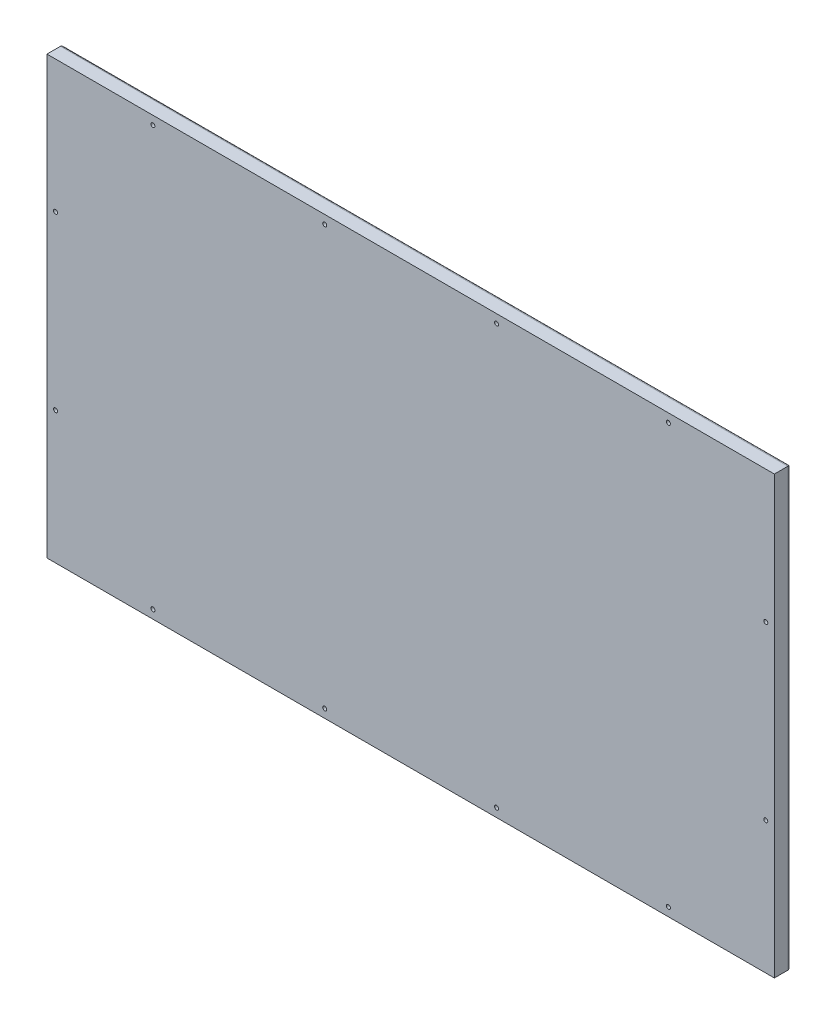
ISO-10303-21;
HEADER;
FILE_DESCRIPTION(('STEP AP214'),'2;1');
FILE_NAME('part.step','',(''),(''),'','','');
FILE_SCHEMA(('AUTOMOTIVE_DESIGN { 1 0 10303 214 1 1 1 1 }'));
ENDSEC;
DATA;
#1=APPLICATION_CONTEXT('core data for automotive mechanical design processes');
#2=APPLICATION_PROTOCOL_DEFINITION('international standard','automotive_design',2000,#1);
#3=PRODUCT_CONTEXT('',#1,'mechanical');
#4=PRODUCT('Part','Part','',(#3));
#5=PRODUCT_RELATED_PRODUCT_CATEGORY('part','',(#4));
#6=PRODUCT_DEFINITION_FORMATION('','',#4);
#7=PRODUCT_DEFINITION_CONTEXT('part definition',#1,'design');
#8=PRODUCT_DEFINITION('design','',#6,#7);
#9=PRODUCT_DEFINITION_SHAPE('','',#8);
#10=(LENGTH_UNIT() NAMED_UNIT(*) SI_UNIT(.MILLI.,.METRE.));
#11=(NAMED_UNIT(*) PLANE_ANGLE_UNIT() SI_UNIT($,.RADIAN.));
#12=(NAMED_UNIT(*) SI_UNIT($,.STERADIAN.) SOLID_ANGLE_UNIT());
#13=UNCERTAINTY_MEASURE_WITH_UNIT(LENGTH_MEASURE(1.E-05),#10,'distance_accuracy_value','');
#14=(GEOMETRIC_REPRESENTATION_CONTEXT(3) GLOBAL_UNCERTAINTY_ASSIGNED_CONTEXT((#13)) GLOBAL_UNIT_ASSIGNED_CONTEXT((#10,
#11,#12)) REPRESENTATION_CONTEXT('',''));
#15=CARTESIAN_POINT('',(0.,0.,0.));
#16=DIRECTION('',(0.,0.,1.));
#17=DIRECTION('',(1.,0.,0.));
#18=AXIS2_PLACEMENT_3D('',#15,#16,#17);
#19=CARTESIAN_POINT('',(635.,381.,28.575));
#20=DIRECTION('',(-1.,0.,0.));
#21=DIRECTION('',(0.,-1.,0.));
#22=AXIS2_PLACEMENT_3D('',#19,#20,#21);
#23=PLANE('',#22);
#24=DIRECTION('',(0.,0.,-1.));
#25=VECTOR('',#24,1.);
#26=CARTESIAN_POINT('',(635.,-381.,28.575));
#27=LINE('',#26,#25);
#28=CARTESIAN_POINT('',(635.,-381.,28.575));
#29=VERTEX_POINT('',#28);
#30=CARTESIAN_POINT('',(635.,-381.,5.));
#31=VERTEX_POINT('',#30);
#32=EDGE_CURVE('E361',#29,#31,#27,.T.);
#33=ORIENTED_EDGE('',*,*,#32,.T.);
#34=DIRECTION('',(0.,1.,0.));
#35=VECTOR('',#34,1.);
#36=CARTESIAN_POINT('',(635.,381.,5.));
#37=LINE('',#36,#35);
#38=CARTESIAN_POINT('',(635.,381.,5.));
#39=VERTEX_POINT('',#38);
#40=EDGE_CURVE('E11',#31,#39,#37,.T.);
#41=ORIENTED_EDGE('',*,*,#40,.T.);
#42=DIRECTION('',(0.,0.,-1.));
#43=VECTOR('',#42,1.);
#44=CARTESIAN_POINT('',(635.,381.,28.575));
#45=LINE('',#44,#43);
#46=CARTESIAN_POINT('',(635.,381.,28.575));
#47=VERTEX_POINT('',#46);
#48=EDGE_CURVE('E101',#47,#39,#45,.T.);
#49=ORIENTED_EDGE('',*,*,#48,.F.);
#50=DIRECTION('',(0.,1.,0.));
#51=VECTOR('',#50,1.);
#52=CARTESIAN_POINT('',(635.,381.,28.575));
#53=LINE('',#52,#51);
#54=EDGE_CURVE('E107',#29,#47,#53,.T.);
#55=ORIENTED_EDGE('',*,*,#54,.F.);
#56=EDGE_LOOP('',(#33,#41,#49,#55));
#57=FACE_BOUND('',#56,.T.);
#58=ADVANCED_FACE('F45',(#57),#23,.F.);
#59=CARTESIAN_POINT('',(-635.,381.,28.575));
#60=DIRECTION('',(0.,-1.,0.));
#61=DIRECTION('',(0.,0.,-1.));
#62=AXIS2_PLACEMENT_3D('',#59,#60,#61);
#63=PLANE('',#62);
#64=ORIENTED_EDGE('',*,*,#48,.T.);
#65=DIRECTION('',(-1.,0.,0.));
#66=VECTOR('',#65,1.);
#67=CARTESIAN_POINT('',(-635.,381.,5.));
#68=LINE('',#67,#66);
#69=CARTESIAN_POINT('',(-635.,381.,5.));
#70=VERTEX_POINT('',#69);
#71=EDGE_CURVE('E55',#39,#70,#68,.T.);
#72=ORIENTED_EDGE('',*,*,#71,.T.);
#73=DIRECTION('',(0.,0.,-1.));
#74=VECTOR('',#73,1.);
#75=CARTESIAN_POINT('',(-635.,381.,28.575));
#76=LINE('',#75,#74);
#77=CARTESIAN_POINT('',(-635.,381.,28.575));
#78=VERTEX_POINT('',#77);
#79=EDGE_CURVE('E102',#78,#70,#76,.T.);
#80=ORIENTED_EDGE('',*,*,#79,.F.);
#81=DIRECTION('',(-1.,0.,0.));
#82=VECTOR('',#81,1.);
#83=CARTESIAN_POINT('',(-635.,381.,28.575));
#84=LINE('',#83,#82);
#85=EDGE_CURVE('E98',#47,#78,#84,.T.);
#86=ORIENTED_EDGE('',*,*,#85,.F.);
#87=EDGE_LOOP('',(#64,#72,#80,#86));
#88=FACE_BOUND('',#87,.T.);
#89=ADVANCED_FACE('F100',(#88),#63,.F.);
#90=CARTESIAN_POINT('',(-635.,381.,28.575));
#91=DIRECTION('',(1.,0.,0.));
#92=DIRECTION('',(0.,1.,0.));
#93=AXIS2_PLACEMENT_3D('',#90,#91,#92);
#94=PLANE('',#93);
#95=ORIENTED_EDGE('',*,*,#79,.T.);
#96=DIRECTION('',(0.,-1.,0.));
#97=VECTOR('',#96,1.);
#98=CARTESIAN_POINT('',(-635.,381.,5.));
#99=LINE('',#98,#97);
#100=CARTESIAN_POINT('',(-635.,-381.,5.));
#101=VERTEX_POINT('',#100);
#102=EDGE_CURVE('E141',#70,#101,#99,.T.);
#103=ORIENTED_EDGE('',*,*,#102,.T.);
#104=DIRECTION('',(0.,0.,-1.));
#105=VECTOR('',#104,1.);
#106=CARTESIAN_POINT('',(-635.,-381.,28.575));
#107=LINE('',#106,#105);
#108=CARTESIAN_POINT('',(-635.,-381.,28.575));
#109=VERTEX_POINT('',#108);
#110=EDGE_CURVE('E125',#109,#101,#107,.T.);
#111=ORIENTED_EDGE('',*,*,#110,.F.);
#112=DIRECTION('',(0.,-1.,0.));
#113=VECTOR('',#112,1.);
#114=CARTESIAN_POINT('',(-635.,381.,28.575));
#115=LINE('',#114,#113);
#116=EDGE_CURVE('E106',#78,#109,#115,.T.);
#117=ORIENTED_EDGE('',*,*,#116,.F.);
#118=EDGE_LOOP('',(#95,#103,#111,#117));
#119=FACE_BOUND('',#118,.T.);
#120=ADVANCED_FACE('F390',(#119),#94,.F.);
#121=CARTESIAN_POINT('',(-635.,-381.,28.575));
#122=DIRECTION('',(0.,1.,0.));
#123=DIRECTION('',(0.,0.,1.));
#124=AXIS2_PLACEMENT_3D('',#121,#122,#123);
#125=PLANE('',#124);
#126=ORIENTED_EDGE('',*,*,#110,.T.);
#127=DIRECTION('',(1.,0.,0.));
#128=VECTOR('',#127,1.);
#129=CARTESIAN_POINT('',(-635.,-381.,5.));
#130=LINE('',#129,#128);
#131=EDGE_CURVE('E118',#101,#31,#130,.T.);
#132=ORIENTED_EDGE('',*,*,#131,.T.);
#133=ORIENTED_EDGE('',*,*,#32,.F.);
#134=DIRECTION('',(1.,0.,0.));
#135=VECTOR('',#134,1.);
#136=CARTESIAN_POINT('',(-635.,-381.,28.575));
#137=LINE('',#136,#135);
#138=EDGE_CURVE('E112',#109,#29,#137,.T.);
#139=ORIENTED_EDGE('',*,*,#138,.F.);
#140=EDGE_LOOP('',(#126,#132,#133,#139));
#141=FACE_BOUND('',#140,.T.);
#142=ADVANCED_FACE('F368',(#141),#125,.F.);
#143=CARTESIAN_POINT('',(0.,0.,28.575));
#144=DIRECTION('',(0.,0.,1.));
#145=DIRECTION('',(1.,0.,0.));
#146=AXIS2_PLACEMENT_3D('',#143,#144,#145);
#147=PLANE('',#146);
#148=CARTESIAN_POINT('',(-150.,366.,28.575));
#149=DIRECTION('',(0.,0.,-1.));
#150=DIRECTION('',(-1.,0.,0.));
#151=AXIS2_PLACEMENT_3D('',#148,#149,#150);
#152=CIRCLE('',#151,3.5);
#153=CARTESIAN_POINT('',(-153.5,366.,28.575));
#154=VERTEX_POINT('',#153);
#155=EDGE_CURVE('E178',#154,#154,#152,.T.);
#156=ORIENTED_EDGE('',*,*,#155,.T.);
#157=EDGE_LOOP('',(#156));
#158=FACE_BOUND('',#157,.T.);
#159=CARTESIAN_POINT('',(150.,366.,28.575));
#160=DIRECTION('',(0.,0.,-1.));
#161=DIRECTION('',(-1.,0.,0.));
#162=AXIS2_PLACEMENT_3D('',#159,#160,#161);
#163=CIRCLE('',#162,3.5);
#164=CARTESIAN_POINT('',(146.5,366.,28.575));
#165=VERTEX_POINT('',#164);
#166=EDGE_CURVE('E194',#165,#165,#163,.T.);
#167=ORIENTED_EDGE('',*,*,#166,.T.);
#168=EDGE_LOOP('',(#167));
#169=FACE_BOUND('',#168,.T.);
#170=CARTESIAN_POINT('',(620.,150.,28.575));
#171=DIRECTION('',(0.,0.,-1.));
#172=DIRECTION('',(-1.,0.,0.));
#173=AXIS2_PLACEMENT_3D('',#170,#171,#172);
#174=CIRCLE('',#173,3.49999999999995);
#175=CARTESIAN_POINT('',(616.5,150.,28.575));
#176=VERTEX_POINT('',#175);
#177=EDGE_CURVE('E210',#176,#176,#174,.T.);
#178=ORIENTED_EDGE('',*,*,#177,.T.);
#179=EDGE_LOOP('',(#178));
#180=FACE_BOUND('',#179,.T.);
#181=CARTESIAN_POINT('',(620.,-150.,28.575));
#182=DIRECTION('',(0.,0.,-1.));
#183=DIRECTION('',(-1.,0.,0.));
#184=AXIS2_PLACEMENT_3D('',#181,#182,#183);
#185=CIRCLE('',#184,3.49999999999995);
#186=CARTESIAN_POINT('',(616.5,-150.,28.575));
#187=VERTEX_POINT('',#186);
#188=EDGE_CURVE('E226',#187,#187,#185,.T.);
#189=ORIENTED_EDGE('',*,*,#188,.T.);
#190=EDGE_LOOP('',(#189));
#191=FACE_BOUND('',#190,.T.);
#192=CARTESIAN_POINT('',(150.,-366.,28.575));
#193=DIRECTION('',(0.,0.,-1.));
#194=DIRECTION('',(-1.,0.,0.));
#195=AXIS2_PLACEMENT_3D('',#192,#193,#194);
#196=CIRCLE('',#195,3.5);
#197=CARTESIAN_POINT('',(146.5,-366.,28.575));
#198=VERTEX_POINT('',#197);
#199=EDGE_CURVE('E242',#198,#198,#196,.T.);
#200=ORIENTED_EDGE('',*,*,#199,.T.);
#201=EDGE_LOOP('',(#200));
#202=FACE_BOUND('',#201,.T.);
#203=CARTESIAN_POINT('',(-150.,-366.,28.575));
#204=DIRECTION('',(0.,0.,-1.));
#205=DIRECTION('',(-1.,0.,0.));
#206=AXIS2_PLACEMENT_3D('',#203,#204,#205);
#207=CIRCLE('',#206,3.5);
#208=CARTESIAN_POINT('',(-153.5,-366.,28.575));
#209=VERTEX_POINT('',#208);
#210=EDGE_CURVE('E258',#209,#209,#207,.T.);
#211=ORIENTED_EDGE('',*,*,#210,.T.);
#212=EDGE_LOOP('',(#211));
#213=FACE_BOUND('',#212,.T.);
#214=CARTESIAN_POINT('',(-620.,-150.,28.575));
#215=DIRECTION('',(0.,0.,-1.));
#216=DIRECTION('',(-1.,0.,0.));
#217=AXIS2_PLACEMENT_3D('',#214,#215,#216);
#218=CIRCLE('',#217,3.49999999999995);
#219=CARTESIAN_POINT('',(-623.5,-150.,28.575));
#220=VERTEX_POINT('',#219);
#221=EDGE_CURVE('E274',#220,#220,#218,.T.);
#222=ORIENTED_EDGE('',*,*,#221,.T.);
#223=EDGE_LOOP('',(#222));
#224=FACE_BOUND('',#223,.T.);
#225=CARTESIAN_POINT('',(-620.,150.,28.575));
#226=DIRECTION('',(0.,0.,-1.));
#227=DIRECTION('',(-1.,0.,0.));
#228=AXIS2_PLACEMENT_3D('',#225,#226,#227);
#229=CIRCLE('',#228,3.49999999999995);
#230=CARTESIAN_POINT('',(-623.5,150.,28.575));
#231=VERTEX_POINT('',#230);
#232=EDGE_CURVE('E290',#231,#231,#229,.T.);
#233=ORIENTED_EDGE('',*,*,#232,.T.);
#234=EDGE_LOOP('',(#233));
#235=FACE_BOUND('',#234,.T.);
#236=CARTESIAN_POINT('',(-450.,366.,28.575));
#237=DIRECTION('',(0.,0.,-1.));
#238=DIRECTION('',(-1.,0.,0.));
#239=AXIS2_PLACEMENT_3D('',#236,#237,#238);
#240=CIRCLE('',#239,3.5);
#241=CARTESIAN_POINT('',(-453.5,366.,28.575));
#242=VERTEX_POINT('',#241);
#243=EDGE_CURVE('E306',#242,#242,#240,.T.);
#244=ORIENTED_EDGE('',*,*,#243,.T.);
#245=EDGE_LOOP('',(#244));
#246=FACE_BOUND('',#245,.T.);
#247=CARTESIAN_POINT('',(450.,366.,28.575));
#248=DIRECTION('',(0.,0.,-1.));
#249=DIRECTION('',(-1.,0.,0.));
#250=AXIS2_PLACEMENT_3D('',#247,#248,#249);
#251=CIRCLE('',#250,3.5);
#252=CARTESIAN_POINT('',(446.5,366.,28.575));
#253=VERTEX_POINT('',#252);
#254=EDGE_CURVE('E322',#253,#253,#251,.T.);
#255=ORIENTED_EDGE('',*,*,#254,.T.);
#256=EDGE_LOOP('',(#255));
#257=FACE_BOUND('',#256,.T.);
#258=CARTESIAN_POINT('',(450.,-366.,28.575));
#259=DIRECTION('',(0.,0.,-1.));
#260=DIRECTION('',(-1.,0.,0.));
#261=AXIS2_PLACEMENT_3D('',#258,#259,#260);
#262=CIRCLE('',#261,3.5);
#263=CARTESIAN_POINT('',(446.5,-366.,28.575));
#264=VERTEX_POINT('',#263);
#265=EDGE_CURVE('E338',#264,#264,#262,.T.);
#266=ORIENTED_EDGE('',*,*,#265,.T.);
#267=EDGE_LOOP('',(#266));
#268=FACE_BOUND('',#267,.T.);
#269=CARTESIAN_POINT('',(-450.,-366.,28.575));
#270=DIRECTION('',(0.,0.,-1.));
#271=DIRECTION('',(-1.,0.,0.));
#272=AXIS2_PLACEMENT_3D('',#269,#270,#271);
#273=CIRCLE('',#272,3.5);
#274=CARTESIAN_POINT('',(-453.5,-366.,28.575));
#275=VERTEX_POINT('',#274);
#276=EDGE_CURVE('E115',#275,#275,#273,.T.);
#277=ORIENTED_EDGE('',*,*,#276,.T.);
#278=EDGE_LOOP('',(#277));
#279=FACE_BOUND('',#278,.T.);
#280=ORIENTED_EDGE('',*,*,#54,.T.);
#281=ORIENTED_EDGE('',*,*,#85,.T.);
#282=ORIENTED_EDGE('',*,*,#116,.T.);
#283=ORIENTED_EDGE('',*,*,#138,.T.);
#284=EDGE_LOOP('',(#280,#281,#282,#283));
#285=FACE_BOUND('',#284,.T.);
#286=ADVANCED_FACE('F110',(#158,#169,#180,#191,#202,#213,#224,#235,#246,#257,#268,#279,#285),
#147,.T.);
#287=CARTESIAN_POINT('',(0.,0.,0.));
#288=DIRECTION('',(0.,0.,1.));
#289=DIRECTION('',(1.,0.,0.));
#290=AXIS2_PLACEMENT_3D('',#287,#288,#289);
#291=PLANE('',#290);
#292=DIRECTION('',(0.,1.,0.));
#293=VECTOR('',#292,1.);
#294=CARTESIAN_POINT('',(630.,0.,0.));
#295=LINE('',#294,#293);
#296=CARTESIAN_POINT('',(630.,376.,0.));
#297=VERTEX_POINT('',#296);
#298=CARTESIAN_POINT('',(630.,-376.,0.));
#299=VERTEX_POINT('',#298);
#300=EDGE_CURVE('E123',#297,#299,#295,.F.);
#301=ORIENTED_EDGE('',*,*,#300,.T.);
#302=DIRECTION('',(1.,0.,0.));
#303=VECTOR('',#302,1.);
#304=CARTESIAN_POINT('',(0.,-376.,0.));
#305=LINE('',#304,#303);
#306=CARTESIAN_POINT('',(-630.,-376.,0.));
#307=VERTEX_POINT('',#306);
#308=EDGE_CURVE('E137',#299,#307,#305,.F.);
#309=ORIENTED_EDGE('',*,*,#308,.T.);
#310=DIRECTION('',(0.,-1.,0.));
#311=VECTOR('',#310,1.);
#312=CARTESIAN_POINT('',(-630.,0.,0.));
#313=LINE('',#312,#311);
#314=CARTESIAN_POINT('',(-630.,376.,0.));
#315=VERTEX_POINT('',#314);
#316=EDGE_CURVE('E134',#307,#315,#313,.F.);
#317=ORIENTED_EDGE('',*,*,#316,.T.);
#318=DIRECTION('',(-1.,0.,0.));
#319=VECTOR('',#318,1.);
#320=CARTESIAN_POINT('',(0.,376.,0.));
#321=LINE('',#320,#319);
#322=EDGE_CURVE('E131',#315,#297,#321,.F.);
#323=ORIENTED_EDGE('',*,*,#322,.T.);
#324=EDGE_LOOP('',(#301,#309,#317,#323));
#325=FACE_BOUND('',#324,.T.);
#326=CARTESIAN_POINT('',(-150.,366.,0.));
#327=DIRECTION('',(0.,0.,-1.));
#328=DIRECTION('',(-1.,0.,0.));
#329=AXIS2_PLACEMENT_3D('',#326,#327,#328);
#330=CIRCLE('',#329,5.50000000000001);
#331=CARTESIAN_POINT('',(-155.5,366.,0.));
#332=VERTEX_POINT('',#331);
#333=EDGE_CURVE('E159',#332,#332,#330,.T.);
#334=ORIENTED_EDGE('',*,*,#333,.F.);
#335=EDGE_LOOP('',(#334));
#336=FACE_BOUND('',#335,.T.);
#337=CARTESIAN_POINT('',(150.,366.,0.));
#338=DIRECTION('',(0.,0.,-1.));
#339=DIRECTION('',(-1.,0.,0.));
#340=AXIS2_PLACEMENT_3D('',#337,#338,#339);
#341=CIRCLE('',#340,5.50000000000001);
#342=CARTESIAN_POINT('',(144.5,366.,0.));
#343=VERTEX_POINT('',#342);
#344=EDGE_CURVE('E182',#343,#343,#341,.T.);
#345=ORIENTED_EDGE('',*,*,#344,.F.);
#346=EDGE_LOOP('',(#345));
#347=FACE_BOUND('',#346,.T.);
#348=CARTESIAN_POINT('',(620.,150.,0.));
#349=DIRECTION('',(0.,0.,-1.));
#350=DIRECTION('',(-1.,0.,0.));
#351=AXIS2_PLACEMENT_3D('',#348,#349,#350);
#352=CIRCLE('',#351,5.49999999999995);
#353=CARTESIAN_POINT('',(614.5,150.,0.));
#354=VERTEX_POINT('',#353);
#355=EDGE_CURVE('E198',#354,#354,#352,.T.);
#356=ORIENTED_EDGE('',*,*,#355,.F.);
#357=EDGE_LOOP('',(#356));
#358=FACE_BOUND('',#357,.T.);
#359=CARTESIAN_POINT('',(620.,-150.,0.));
#360=DIRECTION('',(0.,0.,-1.));
#361=DIRECTION('',(-1.,0.,0.));
#362=AXIS2_PLACEMENT_3D('',#359,#360,#361);
#363=CIRCLE('',#362,5.49999999999995);
#364=CARTESIAN_POINT('',(614.5,-150.,0.));
#365=VERTEX_POINT('',#364);
#366=EDGE_CURVE('E214',#365,#365,#363,.T.);
#367=ORIENTED_EDGE('',*,*,#366,.F.);
#368=EDGE_LOOP('',(#367));
#369=FACE_BOUND('',#368,.T.);
#370=CARTESIAN_POINT('',(150.,-366.,0.));
#371=DIRECTION('',(0.,0.,-1.));
#372=DIRECTION('',(-1.,0.,0.));
#373=AXIS2_PLACEMENT_3D('',#370,#371,#372);
#374=CIRCLE('',#373,5.50000000000001);
#375=CARTESIAN_POINT('',(144.5,-366.,0.));
#376=VERTEX_POINT('',#375);
#377=EDGE_CURVE('E230',#376,#376,#374,.T.);
#378=ORIENTED_EDGE('',*,*,#377,.F.);
#379=EDGE_LOOP('',(#378));
#380=FACE_BOUND('',#379,.T.);
#381=CARTESIAN_POINT('',(-150.,-366.,0.));
#382=DIRECTION('',(0.,0.,-1.));
#383=DIRECTION('',(-1.,0.,0.));
#384=AXIS2_PLACEMENT_3D('',#381,#382,#383);
#385=CIRCLE('',#384,5.50000000000001);
#386=CARTESIAN_POINT('',(-155.5,-366.,0.));
#387=VERTEX_POINT('',#386);
#388=EDGE_CURVE('E246',#387,#387,#385,.T.);
#389=ORIENTED_EDGE('',*,*,#388,.F.);
#390=EDGE_LOOP('',(#389));
#391=FACE_BOUND('',#390,.T.);
#392=CARTESIAN_POINT('',(-620.,-150.,0.));
#393=DIRECTION('',(0.,0.,-1.));
#394=DIRECTION('',(-1.,0.,0.));
#395=AXIS2_PLACEMENT_3D('',#392,#393,#394);
#396=CIRCLE('',#395,5.49999999999995);
#397=CARTESIAN_POINT('',(-625.5,-150.,0.));
#398=VERTEX_POINT('',#397);
#399=EDGE_CURVE('E262',#398,#398,#396,.T.);
#400=ORIENTED_EDGE('',*,*,#399,.F.);
#401=EDGE_LOOP('',(#400));
#402=FACE_BOUND('',#401,.T.);
#403=CARTESIAN_POINT('',(-620.,150.,0.));
#404=DIRECTION('',(0.,0.,-1.));
#405=DIRECTION('',(-1.,0.,0.));
#406=AXIS2_PLACEMENT_3D('',#403,#404,#405);
#407=CIRCLE('',#406,5.49999999999995);
#408=CARTESIAN_POINT('',(-625.5,150.,0.));
#409=VERTEX_POINT('',#408);
#410=EDGE_CURVE('E278',#409,#409,#407,.T.);
#411=ORIENTED_EDGE('',*,*,#410,.F.);
#412=EDGE_LOOP('',(#411));
#413=FACE_BOUND('',#412,.T.);
#414=CARTESIAN_POINT('',(-450.,366.,0.));
#415=DIRECTION('',(0.,0.,-1.));
#416=DIRECTION('',(-1.,0.,0.));
#417=AXIS2_PLACEMENT_3D('',#414,#415,#416);
#418=CIRCLE('',#417,5.50000000000001);
#419=CARTESIAN_POINT('',(-455.5,366.,0.));
#420=VERTEX_POINT('',#419);
#421=EDGE_CURVE('E294',#420,#420,#418,.T.);
#422=ORIENTED_EDGE('',*,*,#421,.F.);
#423=EDGE_LOOP('',(#422));
#424=FACE_BOUND('',#423,.T.);
#425=CARTESIAN_POINT('',(450.,366.,0.));
#426=DIRECTION('',(0.,0.,-1.));
#427=DIRECTION('',(-1.,0.,0.));
#428=AXIS2_PLACEMENT_3D('',#425,#426,#427);
#429=CIRCLE('',#428,5.50000000000001);
#430=CARTESIAN_POINT('',(444.5,366.,0.));
#431=VERTEX_POINT('',#430);
#432=EDGE_CURVE('E310',#431,#431,#429,.T.);
#433=ORIENTED_EDGE('',*,*,#432,.F.);
#434=EDGE_LOOP('',(#433));
#435=FACE_BOUND('',#434,.T.);
#436=CARTESIAN_POINT('',(450.,-366.,0.));
#437=DIRECTION('',(0.,0.,-1.));
#438=DIRECTION('',(-1.,0.,0.));
#439=AXIS2_PLACEMENT_3D('',#436,#437,#438);
#440=CIRCLE('',#439,5.50000000000001);
#441=CARTESIAN_POINT('',(444.5,-366.,0.));
#442=VERTEX_POINT('',#441);
#443=EDGE_CURVE('E326',#442,#442,#440,.T.);
#444=ORIENTED_EDGE('',*,*,#443,.F.);
#445=EDGE_LOOP('',(#444));
#446=FACE_BOUND('',#445,.T.);
#447=CARTESIAN_POINT('',(-450.,-366.,0.));
#448=DIRECTION('',(0.,0.,-1.));
#449=DIRECTION('',(-1.,0.,0.));
#450=AXIS2_PLACEMENT_3D('',#447,#448,#449);
#451=CIRCLE('',#450,5.50000000000001);
#452=CARTESIAN_POINT('',(-455.5,-366.,0.));
#453=VERTEX_POINT('',#452);
#454=EDGE_CURVE('E342',#453,#453,#451,.T.);
#455=ORIENTED_EDGE('',*,*,#454,.F.);
#456=EDGE_LOOP('',(#455));
#457=FACE_BOUND('',#456,.T.);
#458=ADVANCED_FACE('F397',(#325,#336,#347,#358,#369,#380,#391,#402,#413,#424,#435,#446,#457),
#291,.F.);
#459=CARTESIAN_POINT('',(-450.,-366.,0.));
#460=DIRECTION('',(0.,0.,-1.));
#461=DIRECTION('',(-1.,0.,0.));
#462=AXIS2_PLACEMENT_3D('',#459,#460,#461);
#463=CYLINDRICAL_SURFACE('',#462,3.5);
#464=ORIENTED_EDGE('',*,*,#276,.F.);
#465=EDGE_LOOP('',(#464));
#466=FACE_BOUND('',#465,.T.);
#467=CARTESIAN_POINT('',(-450.,-366.,9.5));
#468=DIRECTION('',(0.,0.,-1.));
#469=DIRECTION('',(-1.,0.,0.));
#470=AXIS2_PLACEMENT_3D('',#467,#468,#469);
#471=CIRCLE('',#470,3.5);
#472=CARTESIAN_POINT('',(-453.5,-366.,9.5));
#473=VERTEX_POINT('',#472);
#474=EDGE_CURVE('E350',#473,#473,#471,.T.);
#475=ORIENTED_EDGE('',*,*,#474,.T.);
#476=EDGE_LOOP('',(#475));
#477=FACE_BOUND('',#476,.T.);
#478=ADVANCED_FACE('F400',(#466,#477),#463,.F.);
#479=CARTESIAN_POINT('',(-446.5,-366.,9.5));
#480=DIRECTION('',(0.,0.,1.));
#481=DIRECTION('',(1.,0.,0.));
#482=AXIS2_PLACEMENT_3D('',#479,#480,#481);
#483=PLANE('',#482);
#484=ORIENTED_EDGE('',*,*,#474,.F.);
#485=EDGE_LOOP('',(#484));
#486=FACE_BOUND('',#485,.T.);
#487=CARTESIAN_POINT('',(-450.,-366.,9.5));
#488=DIRECTION('',(0.,0.,-1.));
#489=DIRECTION('',(-1.,0.,0.));
#490=AXIS2_PLACEMENT_3D('',#487,#488,#489);
#491=CIRCLE('',#490,5.50000000000001);
#492=CARTESIAN_POINT('',(-455.5,-366.,9.5));
#493=VERTEX_POINT('',#492);
#494=EDGE_CURVE('E346',#493,#493,#491,.T.);
#495=ORIENTED_EDGE('',*,*,#494,.T.);
#496=EDGE_LOOP('',(#495));
#497=FACE_BOUND('',#496,.T.);
#498=ADVANCED_FACE('F407',(#486,#497),#483,.F.);
#499=CARTESIAN_POINT('',(-450.,-366.,0.));
#500=DIRECTION('',(0.,0.,-1.));
#501=DIRECTION('',(-1.,0.,0.));
#502=AXIS2_PLACEMENT_3D('',#499,#500,#501);
#503=CYLINDRICAL_SURFACE('',#502,5.50000000000001);
#504=ORIENTED_EDGE('',*,*,#494,.F.);
#505=EDGE_LOOP('',(#504));
#506=FACE_BOUND('',#505,.T.);
#507=ORIENTED_EDGE('',*,*,#454,.T.);
#508=EDGE_LOOP('',(#507));
#509=FACE_BOUND('',#508,.T.);
#510=ADVANCED_FACE('F411',(#506,#509),#503,.F.);
#511=CARTESIAN_POINT('',(450.,-366.,0.));
#512=DIRECTION('',(0.,0.,-1.));
#513=DIRECTION('',(-1.,0.,0.));
#514=AXIS2_PLACEMENT_3D('',#511,#512,#513);
#515=CYLINDRICAL_SURFACE('',#514,3.5);
#516=ORIENTED_EDGE('',*,*,#265,.F.);
#517=EDGE_LOOP('',(#516));
#518=FACE_BOUND('',#517,.T.);
#519=CARTESIAN_POINT('',(450.,-366.,9.5));
#520=DIRECTION('',(0.,0.,-1.));
#521=DIRECTION('',(-1.,0.,0.));
#522=AXIS2_PLACEMENT_3D('',#519,#520,#521);
#523=CIRCLE('',#522,3.5);
#524=CARTESIAN_POINT('',(446.5,-366.,9.5));
#525=VERTEX_POINT('',#524);
#526=EDGE_CURVE('E334',#525,#525,#523,.T.);
#527=ORIENTED_EDGE('',*,*,#526,.T.);
#528=EDGE_LOOP('',(#527));
#529=FACE_BOUND('',#528,.T.);
#530=ADVANCED_FACE('F415',(#518,#529),#515,.F.);
#531=CARTESIAN_POINT('',(453.5,-366.,9.5));
#532=DIRECTION('',(0.,0.,1.));
#533=DIRECTION('',(1.,0.,0.));
#534=AXIS2_PLACEMENT_3D('',#531,#532,#533);
#535=PLANE('',#534);
#536=ORIENTED_EDGE('',*,*,#526,.F.);
#537=EDGE_LOOP('',(#536));
#538=FACE_BOUND('',#537,.T.);
#539=CARTESIAN_POINT('',(450.,-366.,9.5));
#540=DIRECTION('',(0.,0.,-1.));
#541=DIRECTION('',(-1.,0.,0.));
#542=AXIS2_PLACEMENT_3D('',#539,#540,#541);
#543=CIRCLE('',#542,5.50000000000001);
#544=CARTESIAN_POINT('',(444.5,-366.,9.5));
#545=VERTEX_POINT('',#544);
#546=EDGE_CURVE('E330',#545,#545,#543,.T.);
#547=ORIENTED_EDGE('',*,*,#546,.T.);
#548=EDGE_LOOP('',(#547));
#549=FACE_BOUND('',#548,.T.);
#550=ADVANCED_FACE('F419',(#538,#549),#535,.F.);
#551=CARTESIAN_POINT('',(450.,-366.,0.));
#552=DIRECTION('',(0.,0.,-1.));
#553=DIRECTION('',(-1.,0.,0.));
#554=AXIS2_PLACEMENT_3D('',#551,#552,#553);
#555=CYLINDRICAL_SURFACE('',#554,5.50000000000001);
#556=ORIENTED_EDGE('',*,*,#546,.F.);
#557=EDGE_LOOP('',(#556));
#558=FACE_BOUND('',#557,.T.);
#559=ORIENTED_EDGE('',*,*,#443,.T.);
#560=EDGE_LOOP('',(#559));
#561=FACE_BOUND('',#560,.T.);
#562=ADVANCED_FACE('F423',(#558,#561),#555,.F.);
#563=CARTESIAN_POINT('',(450.,366.,0.));
#564=DIRECTION('',(0.,0.,-1.));
#565=DIRECTION('',(-1.,0.,0.));
#566=AXIS2_PLACEMENT_3D('',#563,#564,#565);
#567=CYLINDRICAL_SURFACE('',#566,3.5);
#568=ORIENTED_EDGE('',*,*,#254,.F.);
#569=EDGE_LOOP('',(#568));
#570=FACE_BOUND('',#569,.T.);
#571=CARTESIAN_POINT('',(450.,366.,9.5));
#572=DIRECTION('',(0.,0.,-1.));
#573=DIRECTION('',(-1.,0.,0.));
#574=AXIS2_PLACEMENT_3D('',#571,#572,#573);
#575=CIRCLE('',#574,3.5);
#576=CARTESIAN_POINT('',(446.5,366.,9.5));
#577=VERTEX_POINT('',#576);
#578=EDGE_CURVE('E318',#577,#577,#575,.T.);
#579=ORIENTED_EDGE('',*,*,#578,.T.);
#580=EDGE_LOOP('',(#579));
#581=FACE_BOUND('',#580,.T.);
#582=ADVANCED_FACE('F427',(#570,#581),#567,.F.);
#583=CARTESIAN_POINT('',(453.5,366.,9.5));
#584=DIRECTION('',(0.,0.,1.));
#585=DIRECTION('',(1.,0.,0.));
#586=AXIS2_PLACEMENT_3D('',#583,#584,#585);
#587=PLANE('',#586);
#588=ORIENTED_EDGE('',*,*,#578,.F.);
#589=EDGE_LOOP('',(#588));
#590=FACE_BOUND('',#589,.T.);
#591=CARTESIAN_POINT('',(450.,366.,9.5));
#592=DIRECTION('',(0.,0.,-1.));
#593=DIRECTION('',(-1.,0.,0.));
#594=AXIS2_PLACEMENT_3D('',#591,#592,#593);
#595=CIRCLE('',#594,5.50000000000001);
#596=CARTESIAN_POINT('',(444.5,366.,9.5));
#597=VERTEX_POINT('',#596);
#598=EDGE_CURVE('E314',#597,#597,#595,.T.);
#599=ORIENTED_EDGE('',*,*,#598,.T.);
#600=EDGE_LOOP('',(#599));
#601=FACE_BOUND('',#600,.T.);
#602=ADVANCED_FACE('F431',(#590,#601),#587,.F.);
#603=CARTESIAN_POINT('',(450.,366.,0.));
#604=DIRECTION('',(0.,0.,-1.));
#605=DIRECTION('',(-1.,0.,0.));
#606=AXIS2_PLACEMENT_3D('',#603,#604,#605);
#607=CYLINDRICAL_SURFACE('',#606,5.50000000000001);
#608=ORIENTED_EDGE('',*,*,#598,.F.);
#609=EDGE_LOOP('',(#608));
#610=FACE_BOUND('',#609,.T.);
#611=ORIENTED_EDGE('',*,*,#432,.T.);
#612=EDGE_LOOP('',(#611));
#613=FACE_BOUND('',#612,.T.);
#614=ADVANCED_FACE('F435',(#610,#613),#607,.F.);
#615=CARTESIAN_POINT('',(-450.,366.,0.));
#616=DIRECTION('',(0.,0.,-1.));
#617=DIRECTION('',(-1.,0.,0.));
#618=AXIS2_PLACEMENT_3D('',#615,#616,#617);
#619=CYLINDRICAL_SURFACE('',#618,3.5);
#620=ORIENTED_EDGE('',*,*,#243,.F.);
#621=EDGE_LOOP('',(#620));
#622=FACE_BOUND('',#621,.T.);
#623=CARTESIAN_POINT('',(-450.,366.,9.5));
#624=DIRECTION('',(0.,0.,-1.));
#625=DIRECTION('',(-1.,0.,0.));
#626=AXIS2_PLACEMENT_3D('',#623,#624,#625);
#627=CIRCLE('',#626,3.5);
#628=CARTESIAN_POINT('',(-453.5,366.,9.5));
#629=VERTEX_POINT('',#628);
#630=EDGE_CURVE('E302',#629,#629,#627,.T.);
#631=ORIENTED_EDGE('',*,*,#630,.T.);
#632=EDGE_LOOP('',(#631));
#633=FACE_BOUND('',#632,.T.);
#634=ADVANCED_FACE('F439',(#622,#633),#619,.F.);
#635=CARTESIAN_POINT('',(-446.5,366.,9.5));
#636=DIRECTION('',(0.,0.,1.));
#637=DIRECTION('',(1.,0.,0.));
#638=AXIS2_PLACEMENT_3D('',#635,#636,#637);
#639=PLANE('',#638);
#640=ORIENTED_EDGE('',*,*,#630,.F.);
#641=EDGE_LOOP('',(#640));
#642=FACE_BOUND('',#641,.T.);
#643=CARTESIAN_POINT('',(-450.,366.,9.5));
#644=DIRECTION('',(0.,0.,-1.));
#645=DIRECTION('',(-1.,0.,0.));
#646=AXIS2_PLACEMENT_3D('',#643,#644,#645);
#647=CIRCLE('',#646,5.50000000000001);
#648=CARTESIAN_POINT('',(-455.5,366.,9.5));
#649=VERTEX_POINT('',#648);
#650=EDGE_CURVE('E298',#649,#649,#647,.T.);
#651=ORIENTED_EDGE('',*,*,#650,.T.);
#652=EDGE_LOOP('',(#651));
#653=FACE_BOUND('',#652,.T.);
#654=ADVANCED_FACE('F443',(#642,#653),#639,.F.);
#655=CARTESIAN_POINT('',(-450.,366.,0.));
#656=DIRECTION('',(0.,0.,-1.));
#657=DIRECTION('',(-1.,0.,0.));
#658=AXIS2_PLACEMENT_3D('',#655,#656,#657);
#659=CYLINDRICAL_SURFACE('',#658,5.50000000000001);
#660=ORIENTED_EDGE('',*,*,#650,.F.);
#661=EDGE_LOOP('',(#660));
#662=FACE_BOUND('',#661,.T.);
#663=ORIENTED_EDGE('',*,*,#421,.T.);
#664=EDGE_LOOP('',(#663));
#665=FACE_BOUND('',#664,.T.);
#666=ADVANCED_FACE('F447',(#662,#665),#659,.F.);
#667=CARTESIAN_POINT('',(-620.,150.,0.));
#668=DIRECTION('',(0.,0.,-1.));
#669=DIRECTION('',(-1.,0.,0.));
#670=AXIS2_PLACEMENT_3D('',#667,#668,#669);
#671=CYLINDRICAL_SURFACE('',#670,3.49999999999995);
#672=ORIENTED_EDGE('',*,*,#232,.F.);
#673=EDGE_LOOP('',(#672));
#674=FACE_BOUND('',#673,.T.);
#675=CARTESIAN_POINT('',(-620.,150.,9.5));
#676=DIRECTION('',(0.,0.,-1.));
#677=DIRECTION('',(-1.,0.,0.));
#678=AXIS2_PLACEMENT_3D('',#675,#676,#677);
#679=CIRCLE('',#678,3.49999999999995);
#680=CARTESIAN_POINT('',(-623.5,150.,9.5));
#681=VERTEX_POINT('',#680);
#682=EDGE_CURVE('E286',#681,#681,#679,.T.);
#683=ORIENTED_EDGE('',*,*,#682,.T.);
#684=EDGE_LOOP('',(#683));
#685=FACE_BOUND('',#684,.T.);
#686=ADVANCED_FACE('F451',(#674,#685),#671,.F.);
#687=CARTESIAN_POINT('',(-616.5,150.,9.5));
#688=DIRECTION('',(0.,0.,1.));
#689=DIRECTION('',(1.,0.,0.));
#690=AXIS2_PLACEMENT_3D('',#687,#688,#689);
#691=PLANE('',#690);
#692=ORIENTED_EDGE('',*,*,#682,.F.);
#693=EDGE_LOOP('',(#692));
#694=FACE_BOUND('',#693,.T.);
#695=CARTESIAN_POINT('',(-620.,150.,9.5));
#696=DIRECTION('',(0.,0.,-1.));
#697=DIRECTION('',(-1.,0.,0.));
#698=AXIS2_PLACEMENT_3D('',#695,#696,#697);
#699=CIRCLE('',#698,5.49999999999995);
#700=CARTESIAN_POINT('',(-625.5,150.,9.5));
#701=VERTEX_POINT('',#700);
#702=EDGE_CURVE('E282',#701,#701,#699,.T.);
#703=ORIENTED_EDGE('',*,*,#702,.T.);
#704=EDGE_LOOP('',(#703));
#705=FACE_BOUND('',#704,.T.);
#706=ADVANCED_FACE('F455',(#694,#705),#691,.F.);
#707=CARTESIAN_POINT('',(-620.,150.,0.));
#708=DIRECTION('',(0.,0.,-1.));
#709=DIRECTION('',(-1.,0.,0.));
#710=AXIS2_PLACEMENT_3D('',#707,#708,#709);
#711=CYLINDRICAL_SURFACE('',#710,5.49999999999995);
#712=ORIENTED_EDGE('',*,*,#702,.F.);
#713=EDGE_LOOP('',(#712));
#714=FACE_BOUND('',#713,.T.);
#715=ORIENTED_EDGE('',*,*,#410,.T.);
#716=EDGE_LOOP('',(#715));
#717=FACE_BOUND('',#716,.T.);
#718=ADVANCED_FACE('F459',(#714,#717),#711,.F.);
#719=CARTESIAN_POINT('',(-620.,-150.,0.));
#720=DIRECTION('',(0.,0.,-1.));
#721=DIRECTION('',(-1.,0.,0.));
#722=AXIS2_PLACEMENT_3D('',#719,#720,#721);
#723=CYLINDRICAL_SURFACE('',#722,3.49999999999995);
#724=ORIENTED_EDGE('',*,*,#221,.F.);
#725=EDGE_LOOP('',(#724));
#726=FACE_BOUND('',#725,.T.);
#727=CARTESIAN_POINT('',(-620.,-150.,9.5));
#728=DIRECTION('',(0.,0.,-1.));
#729=DIRECTION('',(-1.,0.,0.));
#730=AXIS2_PLACEMENT_3D('',#727,#728,#729);
#731=CIRCLE('',#730,3.49999999999995);
#732=CARTESIAN_POINT('',(-623.5,-150.,9.5));
#733=VERTEX_POINT('',#732);
#734=EDGE_CURVE('E270',#733,#733,#731,.T.);
#735=ORIENTED_EDGE('',*,*,#734,.T.);
#736=EDGE_LOOP('',(#735));
#737=FACE_BOUND('',#736,.T.);
#738=ADVANCED_FACE('F463',(#726,#737),#723,.F.);
#739=CARTESIAN_POINT('',(-616.5,-150.,9.5));
#740=DIRECTION('',(0.,0.,1.));
#741=DIRECTION('',(1.,0.,0.));
#742=AXIS2_PLACEMENT_3D('',#739,#740,#741);
#743=PLANE('',#742);
#744=ORIENTED_EDGE('',*,*,#734,.F.);
#745=EDGE_LOOP('',(#744));
#746=FACE_BOUND('',#745,.T.);
#747=CARTESIAN_POINT('',(-620.,-150.,9.5));
#748=DIRECTION('',(0.,0.,-1.));
#749=DIRECTION('',(-1.,0.,0.));
#750=AXIS2_PLACEMENT_3D('',#747,#748,#749);
#751=CIRCLE('',#750,5.49999999999995);
#752=CARTESIAN_POINT('',(-625.5,-150.,9.5));
#753=VERTEX_POINT('',#752);
#754=EDGE_CURVE('E266',#753,#753,#751,.T.);
#755=ORIENTED_EDGE('',*,*,#754,.T.);
#756=EDGE_LOOP('',(#755));
#757=FACE_BOUND('',#756,.T.);
#758=ADVANCED_FACE('F467',(#746,#757),#743,.F.);
#759=CARTESIAN_POINT('',(-620.,-150.,0.));
#760=DIRECTION('',(0.,0.,-1.));
#761=DIRECTION('',(-1.,0.,0.));
#762=AXIS2_PLACEMENT_3D('',#759,#760,#761);
#763=CYLINDRICAL_SURFACE('',#762,5.49999999999995);
#764=ORIENTED_EDGE('',*,*,#754,.F.);
#765=EDGE_LOOP('',(#764));
#766=FACE_BOUND('',#765,.T.);
#767=ORIENTED_EDGE('',*,*,#399,.T.);
#768=EDGE_LOOP('',(#767));
#769=FACE_BOUND('',#768,.T.);
#770=ADVANCED_FACE('F471',(#766,#769),#763,.F.);
#771=CARTESIAN_POINT('',(-150.,-366.,0.));
#772=DIRECTION('',(0.,0.,-1.));
#773=DIRECTION('',(-1.,0.,0.));
#774=AXIS2_PLACEMENT_3D('',#771,#772,#773);
#775=CYLINDRICAL_SURFACE('',#774,3.5);
#776=ORIENTED_EDGE('',*,*,#210,.F.);
#777=EDGE_LOOP('',(#776));
#778=FACE_BOUND('',#777,.T.);
#779=CARTESIAN_POINT('',(-150.,-366.,9.5));
#780=DIRECTION('',(0.,0.,-1.));
#781=DIRECTION('',(-1.,0.,0.));
#782=AXIS2_PLACEMENT_3D('',#779,#780,#781);
#783=CIRCLE('',#782,3.5);
#784=CARTESIAN_POINT('',(-153.5,-366.,9.5));
#785=VERTEX_POINT('',#784);
#786=EDGE_CURVE('E254',#785,#785,#783,.T.);
#787=ORIENTED_EDGE('',*,*,#786,.T.);
#788=EDGE_LOOP('',(#787));
#789=FACE_BOUND('',#788,.T.);
#790=ADVANCED_FACE('F475',(#778,#789),#775,.F.);
#791=CARTESIAN_POINT('',(-146.5,-366.,9.5));
#792=DIRECTION('',(0.,0.,1.));
#793=DIRECTION('',(1.,0.,0.));
#794=AXIS2_PLACEMENT_3D('',#791,#792,#793);
#795=PLANE('',#794);
#796=ORIENTED_EDGE('',*,*,#786,.F.);
#797=EDGE_LOOP('',(#796));
#798=FACE_BOUND('',#797,.T.);
#799=CARTESIAN_POINT('',(-150.,-366.,9.5));
#800=DIRECTION('',(0.,0.,-1.));
#801=DIRECTION('',(-1.,0.,0.));
#802=AXIS2_PLACEMENT_3D('',#799,#800,#801);
#803=CIRCLE('',#802,5.50000000000001);
#804=CARTESIAN_POINT('',(-155.5,-366.,9.5));
#805=VERTEX_POINT('',#804);
#806=EDGE_CURVE('E250',#805,#805,#803,.T.);
#807=ORIENTED_EDGE('',*,*,#806,.T.);
#808=EDGE_LOOP('',(#807));
#809=FACE_BOUND('',#808,.T.);
#810=ADVANCED_FACE('F479',(#798,#809),#795,.F.);
#811=CARTESIAN_POINT('',(-150.,-366.,0.));
#812=DIRECTION('',(0.,0.,-1.));
#813=DIRECTION('',(-1.,0.,0.));
#814=AXIS2_PLACEMENT_3D('',#811,#812,#813);
#815=CYLINDRICAL_SURFACE('',#814,5.50000000000001);
#816=ORIENTED_EDGE('',*,*,#806,.F.);
#817=EDGE_LOOP('',(#816));
#818=FACE_BOUND('',#817,.T.);
#819=ORIENTED_EDGE('',*,*,#388,.T.);
#820=EDGE_LOOP('',(#819));
#821=FACE_BOUND('',#820,.T.);
#822=ADVANCED_FACE('F483',(#818,#821),#815,.F.);
#823=CARTESIAN_POINT('',(150.,-366.,0.));
#824=DIRECTION('',(0.,0.,-1.));
#825=DIRECTION('',(-1.,0.,0.));
#826=AXIS2_PLACEMENT_3D('',#823,#824,#825);
#827=CYLINDRICAL_SURFACE('',#826,3.5);
#828=ORIENTED_EDGE('',*,*,#199,.F.);
#829=EDGE_LOOP('',(#828));
#830=FACE_BOUND('',#829,.T.);
#831=CARTESIAN_POINT('',(150.,-366.,9.5));
#832=DIRECTION('',(0.,0.,-1.));
#833=DIRECTION('',(-1.,0.,0.));
#834=AXIS2_PLACEMENT_3D('',#831,#832,#833);
#835=CIRCLE('',#834,3.5);
#836=CARTESIAN_POINT('',(146.5,-366.,9.5));
#837=VERTEX_POINT('',#836);
#838=EDGE_CURVE('E238',#837,#837,#835,.T.);
#839=ORIENTED_EDGE('',*,*,#838,.T.);
#840=EDGE_LOOP('',(#839));
#841=FACE_BOUND('',#840,.T.);
#842=ADVANCED_FACE('F487',(#830,#841),#827,.F.);
#843=CARTESIAN_POINT('',(153.5,-366.,9.5));
#844=DIRECTION('',(0.,0.,1.));
#845=DIRECTION('',(1.,0.,0.));
#846=AXIS2_PLACEMENT_3D('',#843,#844,#845);
#847=PLANE('',#846);
#848=ORIENTED_EDGE('',*,*,#838,.F.);
#849=EDGE_LOOP('',(#848));
#850=FACE_BOUND('',#849,.T.);
#851=CARTESIAN_POINT('',(150.,-366.,9.5));
#852=DIRECTION('',(0.,0.,-1.));
#853=DIRECTION('',(-1.,0.,0.));
#854=AXIS2_PLACEMENT_3D('',#851,#852,#853);
#855=CIRCLE('',#854,5.50000000000001);
#856=CARTESIAN_POINT('',(144.5,-366.,9.5));
#857=VERTEX_POINT('',#856);
#858=EDGE_CURVE('E234',#857,#857,#855,.T.);
#859=ORIENTED_EDGE('',*,*,#858,.T.);
#860=EDGE_LOOP('',(#859));
#861=FACE_BOUND('',#860,.T.);
#862=ADVANCED_FACE('F491',(#850,#861),#847,.F.);
#863=CARTESIAN_POINT('',(150.,-366.,0.));
#864=DIRECTION('',(0.,0.,-1.));
#865=DIRECTION('',(-1.,0.,0.));
#866=AXIS2_PLACEMENT_3D('',#863,#864,#865);
#867=CYLINDRICAL_SURFACE('',#866,5.50000000000001);
#868=ORIENTED_EDGE('',*,*,#858,.F.);
#869=EDGE_LOOP('',(#868));
#870=FACE_BOUND('',#869,.T.);
#871=ORIENTED_EDGE('',*,*,#377,.T.);
#872=EDGE_LOOP('',(#871));
#873=FACE_BOUND('',#872,.T.);
#874=ADVANCED_FACE('F495',(#870,#873),#867,.F.);
#875=CARTESIAN_POINT('',(620.,-150.,0.));
#876=DIRECTION('',(0.,0.,-1.));
#877=DIRECTION('',(-1.,0.,0.));
#878=AXIS2_PLACEMENT_3D('',#875,#876,#877);
#879=CYLINDRICAL_SURFACE('',#878,3.49999999999995);
#880=ORIENTED_EDGE('',*,*,#188,.F.);
#881=EDGE_LOOP('',(#880));
#882=FACE_BOUND('',#881,.T.);
#883=CARTESIAN_POINT('',(620.,-150.,9.5));
#884=DIRECTION('',(0.,0.,-1.));
#885=DIRECTION('',(-1.,0.,0.));
#886=AXIS2_PLACEMENT_3D('',#883,#884,#885);
#887=CIRCLE('',#886,3.49999999999995);
#888=CARTESIAN_POINT('',(616.5,-150.,9.5));
#889=VERTEX_POINT('',#888);
#890=EDGE_CURVE('E222',#889,#889,#887,.T.);
#891=ORIENTED_EDGE('',*,*,#890,.T.);
#892=EDGE_LOOP('',(#891));
#893=FACE_BOUND('',#892,.T.);
#894=ADVANCED_FACE('F499',(#882,#893),#879,.F.);
#895=CARTESIAN_POINT('',(623.5,-150.,9.5));
#896=DIRECTION('',(0.,0.,1.));
#897=DIRECTION('',(1.,0.,0.));
#898=AXIS2_PLACEMENT_3D('',#895,#896,#897);
#899=PLANE('',#898);
#900=ORIENTED_EDGE('',*,*,#890,.F.);
#901=EDGE_LOOP('',(#900));
#902=FACE_BOUND('',#901,.T.);
#903=CARTESIAN_POINT('',(620.,-150.,9.5));
#904=DIRECTION('',(0.,0.,-1.));
#905=DIRECTION('',(-1.,0.,0.));
#906=AXIS2_PLACEMENT_3D('',#903,#904,#905);
#907=CIRCLE('',#906,5.49999999999995);
#908=CARTESIAN_POINT('',(614.5,-150.,9.5));
#909=VERTEX_POINT('',#908);
#910=EDGE_CURVE('E218',#909,#909,#907,.T.);
#911=ORIENTED_EDGE('',*,*,#910,.T.);
#912=EDGE_LOOP('',(#911));
#913=FACE_BOUND('',#912,.T.);
#914=ADVANCED_FACE('F503',(#902,#913),#899,.F.);
#915=CARTESIAN_POINT('',(620.,-150.,0.));
#916=DIRECTION('',(0.,0.,-1.));
#917=DIRECTION('',(-1.,0.,0.));
#918=AXIS2_PLACEMENT_3D('',#915,#916,#917);
#919=CYLINDRICAL_SURFACE('',#918,5.49999999999995);
#920=ORIENTED_EDGE('',*,*,#910,.F.);
#921=EDGE_LOOP('',(#920));
#922=FACE_BOUND('',#921,.T.);
#923=ORIENTED_EDGE('',*,*,#366,.T.);
#924=EDGE_LOOP('',(#923));
#925=FACE_BOUND('',#924,.T.);
#926=ADVANCED_FACE('F507',(#922,#925),#919,.F.);
#927=CARTESIAN_POINT('',(620.,150.,0.));
#928=DIRECTION('',(0.,0.,-1.));
#929=DIRECTION('',(-1.,0.,0.));
#930=AXIS2_PLACEMENT_3D('',#927,#928,#929);
#931=CYLINDRICAL_SURFACE('',#930,3.49999999999995);
#932=ORIENTED_EDGE('',*,*,#177,.F.);
#933=EDGE_LOOP('',(#932));
#934=FACE_BOUND('',#933,.T.);
#935=CARTESIAN_POINT('',(620.,150.,9.5));
#936=DIRECTION('',(0.,0.,-1.));
#937=DIRECTION('',(-1.,0.,0.));
#938=AXIS2_PLACEMENT_3D('',#935,#936,#937);
#939=CIRCLE('',#938,3.49999999999995);
#940=CARTESIAN_POINT('',(616.5,150.,9.5));
#941=VERTEX_POINT('',#940);
#942=EDGE_CURVE('E206',#941,#941,#939,.T.);
#943=ORIENTED_EDGE('',*,*,#942,.T.);
#944=EDGE_LOOP('',(#943));
#945=FACE_BOUND('',#944,.T.);
#946=ADVANCED_FACE('F511',(#934,#945),#931,.F.);
#947=CARTESIAN_POINT('',(623.5,150.,9.5));
#948=DIRECTION('',(0.,0.,1.));
#949=DIRECTION('',(1.,0.,0.));
#950=AXIS2_PLACEMENT_3D('',#947,#948,#949);
#951=PLANE('',#950);
#952=ORIENTED_EDGE('',*,*,#942,.F.);
#953=EDGE_LOOP('',(#952));
#954=FACE_BOUND('',#953,.T.);
#955=CARTESIAN_POINT('',(620.,150.,9.5));
#956=DIRECTION('',(0.,0.,-1.));
#957=DIRECTION('',(-1.,0.,0.));
#958=AXIS2_PLACEMENT_3D('',#955,#956,#957);
#959=CIRCLE('',#958,5.49999999999995);
#960=CARTESIAN_POINT('',(614.5,150.,9.5));
#961=VERTEX_POINT('',#960);
#962=EDGE_CURVE('E202',#961,#961,#959,.T.);
#963=ORIENTED_EDGE('',*,*,#962,.T.);
#964=EDGE_LOOP('',(#963));
#965=FACE_BOUND('',#964,.T.);
#966=ADVANCED_FACE('F515',(#954,#965),#951,.F.);
#967=CARTESIAN_POINT('',(620.,150.,0.));
#968=DIRECTION('',(0.,0.,-1.));
#969=DIRECTION('',(-1.,0.,0.));
#970=AXIS2_PLACEMENT_3D('',#967,#968,#969);
#971=CYLINDRICAL_SURFACE('',#970,5.49999999999995);
#972=ORIENTED_EDGE('',*,*,#962,.F.);
#973=EDGE_LOOP('',(#972));
#974=FACE_BOUND('',#973,.T.);
#975=ORIENTED_EDGE('',*,*,#355,.T.);
#976=EDGE_LOOP('',(#975));
#977=FACE_BOUND('',#976,.T.);
#978=ADVANCED_FACE('F519',(#974,#977),#971,.F.);
#979=CARTESIAN_POINT('',(150.,366.,0.));
#980=DIRECTION('',(0.,0.,-1.));
#981=DIRECTION('',(-1.,0.,0.));
#982=AXIS2_PLACEMENT_3D('',#979,#980,#981);
#983=CYLINDRICAL_SURFACE('',#982,3.5);
#984=ORIENTED_EDGE('',*,*,#166,.F.);
#985=EDGE_LOOP('',(#984));
#986=FACE_BOUND('',#985,.T.);
#987=CARTESIAN_POINT('',(150.,366.,9.5));
#988=DIRECTION('',(0.,0.,-1.));
#989=DIRECTION('',(-1.,0.,0.));
#990=AXIS2_PLACEMENT_3D('',#987,#988,#989);
#991=CIRCLE('',#990,3.5);
#992=CARTESIAN_POINT('',(146.5,366.,9.5));
#993=VERTEX_POINT('',#992);
#994=EDGE_CURVE('E190',#993,#993,#991,.T.);
#995=ORIENTED_EDGE('',*,*,#994,.T.);
#996=EDGE_LOOP('',(#995));
#997=FACE_BOUND('',#996,.T.);
#998=ADVANCED_FACE('F523',(#986,#997),#983,.F.);
#999=CARTESIAN_POINT('',(153.5,366.,9.5));
#1000=DIRECTION('',(0.,0.,1.));
#1001=DIRECTION('',(1.,0.,0.));
#1002=AXIS2_PLACEMENT_3D('',#999,#1000,#1001);
#1003=PLANE('',#1002);
#1004=ORIENTED_EDGE('',*,*,#994,.F.);
#1005=EDGE_LOOP('',(#1004));
#1006=FACE_BOUND('',#1005,.T.);
#1007=CARTESIAN_POINT('',(150.,366.,9.5));
#1008=DIRECTION('',(0.,0.,-1.));
#1009=DIRECTION('',(-1.,0.,0.));
#1010=AXIS2_PLACEMENT_3D('',#1007,#1008,#1009);
#1011=CIRCLE('',#1010,5.50000000000001);
#1012=CARTESIAN_POINT('',(144.5,366.,9.5));
#1013=VERTEX_POINT('',#1012);
#1014=EDGE_CURVE('E186',#1013,#1013,#1011,.T.);
#1015=ORIENTED_EDGE('',*,*,#1014,.T.);
#1016=EDGE_LOOP('',(#1015));
#1017=FACE_BOUND('',#1016,.T.);
#1018=ADVANCED_FACE('F527',(#1006,#1017),#1003,.F.);
#1019=CARTESIAN_POINT('',(150.,366.,0.));
#1020=DIRECTION('',(0.,0.,-1.));
#1021=DIRECTION('',(-1.,0.,0.));
#1022=AXIS2_PLACEMENT_3D('',#1019,#1020,#1021);
#1023=CYLINDRICAL_SURFACE('',#1022,5.50000000000001);
#1024=ORIENTED_EDGE('',*,*,#1014,.F.);
#1025=EDGE_LOOP('',(#1024));
#1026=FACE_BOUND('',#1025,.T.);
#1027=ORIENTED_EDGE('',*,*,#344,.T.);
#1028=EDGE_LOOP('',(#1027));
#1029=FACE_BOUND('',#1028,.T.);
#1030=ADVANCED_FACE('F531',(#1026,#1029),#1023,.F.);
#1031=CARTESIAN_POINT('',(-150.,366.,0.));
#1032=DIRECTION('',(0.,0.,-1.));
#1033=DIRECTION('',(-1.,0.,0.));
#1034=AXIS2_PLACEMENT_3D('',#1031,#1032,#1033);
#1035=CYLINDRICAL_SURFACE('',#1034,3.5);
#1036=ORIENTED_EDGE('',*,*,#155,.F.);
#1037=EDGE_LOOP('',(#1036));
#1038=FACE_BOUND('',#1037,.T.);
#1039=CARTESIAN_POINT('',(-150.,366.,9.5));
#1040=DIRECTION('',(0.,0.,-1.));
#1041=DIRECTION('',(-1.,0.,0.));
#1042=AXIS2_PLACEMENT_3D('',#1039,#1040,#1041);
#1043=CIRCLE('',#1042,3.5);
#1044=CARTESIAN_POINT('',(-153.5,366.,9.5));
#1045=VERTEX_POINT('',#1044);
#1046=EDGE_CURVE('E172',#1045,#1045,#1043,.T.);
#1047=ORIENTED_EDGE('',*,*,#1046,.T.);
#1048=EDGE_LOOP('',(#1047));
#1049=FACE_BOUND('',#1048,.T.);
#1050=ADVANCED_FACE('F535',(#1038,#1049),#1035,.F.);
#1051=CARTESIAN_POINT('',(-146.5,366.,9.5));
#1052=DIRECTION('',(0.,0.,1.));
#1053=DIRECTION('',(1.,0.,0.));
#1054=AXIS2_PLACEMENT_3D('',#1051,#1052,#1053);
#1055=PLANE('',#1054);
#1056=ORIENTED_EDGE('',*,*,#1046,.F.);
#1057=EDGE_LOOP('',(#1056));
#1058=FACE_BOUND('',#1057,.T.);
#1059=CARTESIAN_POINT('',(-150.,366.,9.5));
#1060=DIRECTION('',(0.,0.,-1.));
#1061=DIRECTION('',(-1.,0.,0.));
#1062=AXIS2_PLACEMENT_3D('',#1059,#1060,#1061);
#1063=CIRCLE('',#1062,5.50000000000001);
#1064=CARTESIAN_POINT('',(-155.5,366.,9.5));
#1065=VERTEX_POINT('',#1064);
#1066=EDGE_CURVE('E166',#1065,#1065,#1063,.T.);
#1067=ORIENTED_EDGE('',*,*,#1066,.T.);
#1068=EDGE_LOOP('',(#1067));
#1069=FACE_BOUND('',#1068,.T.);
#1070=ADVANCED_FACE('F539',(#1058,#1069),#1055,.F.);
#1071=CARTESIAN_POINT('',(-150.,366.,0.));
#1072=DIRECTION('',(0.,0.,-1.));
#1073=DIRECTION('',(-1.,0.,0.));
#1074=AXIS2_PLACEMENT_3D('',#1071,#1072,#1073);
#1075=CYLINDRICAL_SURFACE('',#1074,5.50000000000001);
#1076=ORIENTED_EDGE('',*,*,#1066,.F.);
#1077=EDGE_LOOP('',(#1076));
#1078=FACE_BOUND('',#1077,.T.);
#1079=ORIENTED_EDGE('',*,*,#333,.T.);
#1080=EDGE_LOOP('',(#1079));
#1081=FACE_BOUND('',#1080,.T.);
#1082=ADVANCED_FACE('F543',(#1078,#1081),#1075,.F.);
#1083=CARTESIAN_POINT('',(-635.,376.,5.));
#1084=DIRECTION('',(-1.,0.,0.));
#1085=DIRECTION('',(0.,0.,1.));
#1086=AXIS2_PLACEMENT_3D('',#1083,#1084,#1085);
#1087=CYLINDRICAL_SURFACE('',#1086,5.);
#1088=CARTESIAN_POINT('',(630.,376.,5.));
#1089=DIRECTION('',(-0.707106781186548,0.707106781186547,0.));
#1090=DIRECTION('',(0.707106781186547,0.707106781186548,0.));
#1091=AXIS2_PLACEMENT_3D('',#1088,#1089,#1090);
#1092=ELLIPSE('',#1091,7.07106781186547,5.);
#1093=EDGE_CURVE('E151',#297,#39,#1092,.F.);
#1094=ORIENTED_EDGE('',*,*,#1093,.F.);
#1095=ORIENTED_EDGE('',*,*,#322,.F.);
#1096=CARTESIAN_POINT('',(-630.,376.,5.));
#1097=DIRECTION('',(-0.707106781186547,-0.707106781186548,0.));
#1098=DIRECTION('',(-0.707106781186548,0.707106781186547,0.));
#1099=AXIS2_PLACEMENT_3D('',#1096,#1097,#1098);
#1100=ELLIPSE('',#1099,7.07106781186548,5.);
#1101=EDGE_CURVE('E49',#70,#315,#1100,.T.);
#1102=ORIENTED_EDGE('',*,*,#1101,.F.);
#1103=ORIENTED_EDGE('',*,*,#71,.F.);
#1104=EDGE_LOOP('',(#1094,#1095,#1102,#1103));
#1105=FACE_BOUND('',#1104,.T.);
#1106=ADVANCED_FACE('F47',(#1105),#1087,.T.);
#1107=CARTESIAN_POINT('',(-630.,381.,5.));
#1108=DIRECTION('',(0.,-1.,0.));
#1109=DIRECTION('',(1.,0.,0.));
#1110=AXIS2_PLACEMENT_3D('',#1107,#1108,#1109);
#1111=CYLINDRICAL_SURFACE('',#1110,5.);
#1112=ORIENTED_EDGE('',*,*,#1101,.T.);
#1113=ORIENTED_EDGE('',*,*,#316,.F.);
#1114=CARTESIAN_POINT('',(-630.,-376.,5.));
#1115=DIRECTION('',(0.707106781186548,-0.707106781186547,0.));
#1116=DIRECTION('',(-0.707106781186547,-0.707106781186548,0.));
#1117=AXIS2_PLACEMENT_3D('',#1114,#1115,#1116);
#1118=ELLIPSE('',#1117,7.07106781186547,5.);
#1119=EDGE_CURVE('E149',#101,#307,#1118,.T.);
#1120=ORIENTED_EDGE('',*,*,#1119,.F.);
#1121=ORIENTED_EDGE('',*,*,#102,.F.);
#1122=EDGE_LOOP('',(#1112,#1113,#1120,#1121));
#1123=FACE_BOUND('',#1122,.T.);
#1124=ADVANCED_FACE('F371',(#1123),#1111,.T.);
#1125=CARTESIAN_POINT('',(630.,381.,5.));
#1126=DIRECTION('',(0.,1.,0.));
#1127=DIRECTION('',(-1.,0.,0.));
#1128=AXIS2_PLACEMENT_3D('',#1125,#1126,#1127);
#1129=CYLINDRICAL_SURFACE('',#1128,5.);
#1130=ORIENTED_EDGE('',*,*,#1093,.T.);
#1131=ORIENTED_EDGE('',*,*,#40,.F.);
#1132=CARTESIAN_POINT('',(630.,-376.,5.));
#1133=DIRECTION('',(0.707106781186547,0.707106781186548,0.));
#1134=DIRECTION('',(-0.707106781186548,0.707106781186547,0.));
#1135=AXIS2_PLACEMENT_3D('',#1132,#1133,#1134);
#1136=ELLIPSE('',#1135,7.07106781186548,5.);
#1137=EDGE_CURVE('E146',#299,#31,#1136,.F.);
#1138=ORIENTED_EDGE('',*,*,#1137,.F.);
#1139=ORIENTED_EDGE('',*,*,#300,.F.);
#1140=EDGE_LOOP('',(#1130,#1131,#1138,#1139));
#1141=FACE_BOUND('',#1140,.T.);
#1142=ADVANCED_FACE('F376',(#1141),#1129,.T.);
#1143=CARTESIAN_POINT('',(-635.,-376.,5.));
#1144=DIRECTION('',(1.,0.,0.));
#1145=DIRECTION('',(0.,0.,-1.));
#1146=AXIS2_PLACEMENT_3D('',#1143,#1144,#1145);
#1147=CYLINDRICAL_SURFACE('',#1146,5.);
#1148=ORIENTED_EDGE('',*,*,#1119,.T.);
#1149=ORIENTED_EDGE('',*,*,#308,.F.);
#1150=ORIENTED_EDGE('',*,*,#1137,.T.);
#1151=ORIENTED_EDGE('',*,*,#131,.F.);
#1152=EDGE_LOOP('',(#1148,#1149,#1150,#1151));
#1153=FACE_BOUND('',#1152,.T.);
#1154=ADVANCED_FACE('F374',(#1153),#1147,.T.);
#1155=CLOSED_SHELL('',(#58,#89,#120,#142,#286,#458,#478,#498,#510,#530,#550,#562,#582,#602,#614,
#634,#654,#666,#686,#706,#718,#738,#758,#770,#790,#810,#822,#842,#862,#874,#894,#914,#926,#946,
#966,#978,#998,#1018,#1030,#1050,#1070,#1082,#1106,#1124,#1142,#1154));
#1156=MANIFOLD_SOLID_BREP('B2',#1155);
#1157=ADVANCED_BREP_SHAPE_REPRESENTATION('',(#18,#1156),#14);
#1158=SHAPE_DEFINITION_REPRESENTATION(#9,#1157);
ENDSEC;
END-ISO-10303-21;
